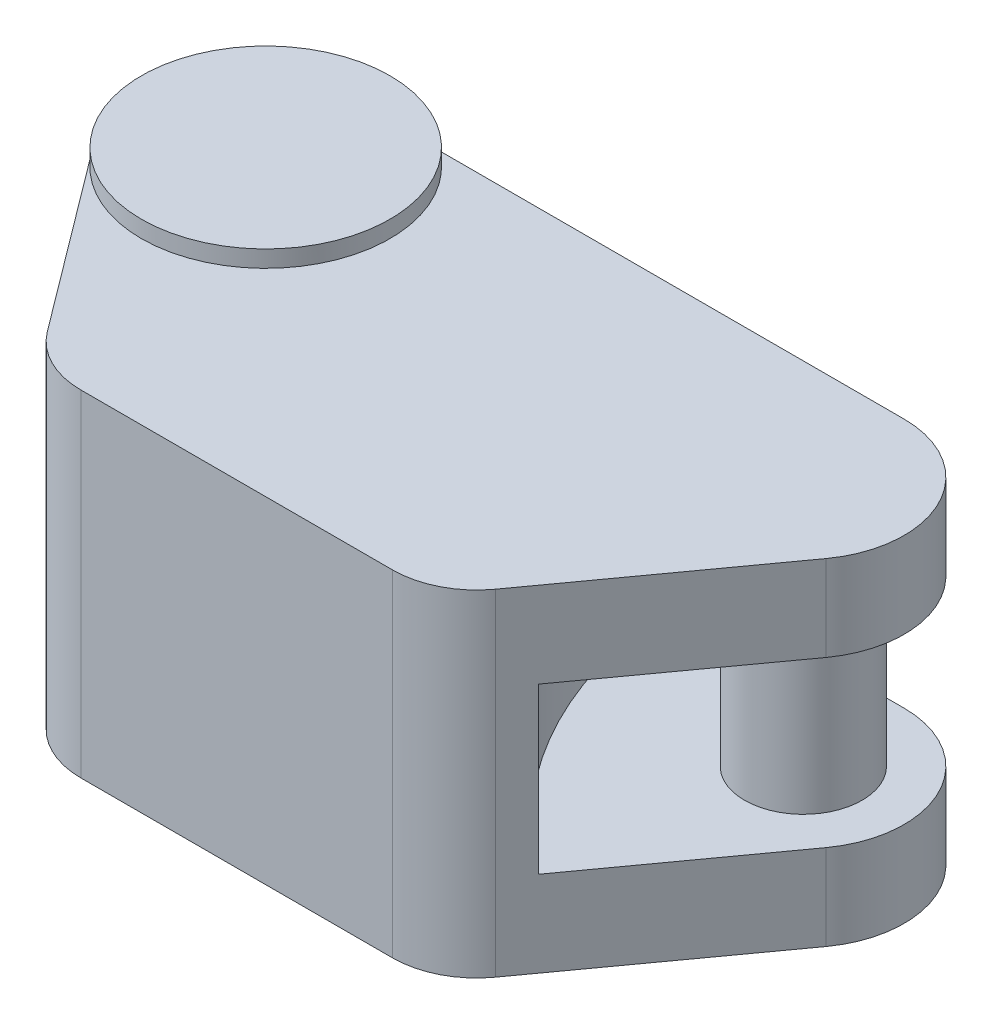
ISO-10303-21;
HEADER;
FILE_DESCRIPTION(('STEP AP214'),'2;1');
FILE_NAME('part.step','',(''),(''),'','','');
FILE_SCHEMA(('AUTOMOTIVE_DESIGN { 1 0 10303 214 1 1 1 1 }'));
ENDSEC;
DATA;
#1=APPLICATION_CONTEXT('core data for automotive mechanical design processes');
#2=APPLICATION_PROTOCOL_DEFINITION('international standard','automotive_design',2000,#1);
#3=PRODUCT_CONTEXT('',#1,'mechanical');
#4=PRODUCT('Part','Part','',(#3));
#5=PRODUCT_RELATED_PRODUCT_CATEGORY('part','',(#4));
#6=PRODUCT_DEFINITION_FORMATION('','',#4);
#7=PRODUCT_DEFINITION_CONTEXT('part definition',#1,'design');
#8=PRODUCT_DEFINITION('design','',#6,#7);
#9=PRODUCT_DEFINITION_SHAPE('','',#8);
#10=(LENGTH_UNIT() NAMED_UNIT(*) SI_UNIT(.MILLI.,.METRE.));
#11=(NAMED_UNIT(*) PLANE_ANGLE_UNIT() SI_UNIT($,.RADIAN.));
#12=(NAMED_UNIT(*) SI_UNIT($,.STERADIAN.) SOLID_ANGLE_UNIT());
#13=UNCERTAINTY_MEASURE_WITH_UNIT(LENGTH_MEASURE(1.E-05),#10,'distance_accuracy_value','');
#14=(GEOMETRIC_REPRESENTATION_CONTEXT(3) GLOBAL_UNCERTAINTY_ASSIGNED_CONTEXT((#13)) GLOBAL_UNIT_ASSIGNED_CONTEXT((#10,
#11,#12)) REPRESENTATION_CONTEXT('',''));
#15=CARTESIAN_POINT('',(0.,0.,0.));
#16=DIRECTION('',(0.,0.,1.));
#17=DIRECTION('',(1.,0.,0.));
#18=AXIS2_PLACEMENT_3D('',#15,#16,#17);
#19=CARTESIAN_POINT('',(203.2,-63.5,-38.1));
#20=DIRECTION('',(0.,0.,-1.));
#21=DIRECTION('',(-1.,0.,0.));
#22=AXIS2_PLACEMENT_3D('',#19,#20,#21);
#23=PLANE('',#22);
#24=DIRECTION('',(0.,1.,0.));
#25=VECTOR('',#24,1.);
#26=CARTESIAN_POINT('',(203.2,-63.5,-38.1));
#27=LINE('',#26,#25);
#28=CARTESIAN_POINT('',(203.2,31.115,-38.1));
#29=VERTEX_POINT('',#28);
#30=CARTESIAN_POINT('',(203.2,63.5,-38.1));
#31=VERTEX_POINT('',#30);
#32=EDGE_CURVE('E217',#29,#31,#27,.T.);
#33=ORIENTED_EDGE('',*,*,#32,.F.);
#34=DIRECTION('',(-1.,0.,0.));
#35=VECTOR('',#34,1.);
#36=CARTESIAN_POINT('',(125.379811820765,31.115,-38.1));
#37=LINE('',#36,#35);
#38=CARTESIAN_POINT('',(125.379811820765,31.115,-38.1));
#39=VERTEX_POINT('',#38);
#40=EDGE_CURVE('E148',#29,#39,#37,.T.);
#41=ORIENTED_EDGE('',*,*,#40,.T.);
#42=DIRECTION('',(0.,-1.,0.));
#43=VECTOR('',#42,1.);
#44=CARTESIAN_POINT('',(125.379811820765,31.115,-38.1));
#45=LINE('',#44,#43);
#46=CARTESIAN_POINT('',(125.379811820765,-31.115,-38.1));
#47=VERTEX_POINT('',#46);
#48=EDGE_CURVE('E139',#39,#47,#45,.T.);
#49=ORIENTED_EDGE('',*,*,#48,.T.);
#50=DIRECTION('',(-1.,0.,0.));
#51=VECTOR('',#50,1.);
#52=CARTESIAN_POINT('',(125.379811820765,-31.115,-38.1));
#53=LINE('',#52,#51);
#54=CARTESIAN_POINT('',(203.2,-31.115,-38.1));
#55=VERTEX_POINT('',#54);
#56=EDGE_CURVE('E126',#55,#47,#53,.T.);
#57=ORIENTED_EDGE('',*,*,#56,.F.);
#58=CARTESIAN_POINT('',(203.2,-63.5,-38.1));
#59=VERTEX_POINT('',#58);
#60=EDGE_CURVE('E215',#59,#55,#27,.T.);
#61=ORIENTED_EDGE('',*,*,#60,.F.);
#62=DIRECTION('',(-1.,0.,0.));
#63=VECTOR('',#62,1.);
#64=CARTESIAN_POINT('',(203.2,-63.5,-38.1));
#65=LINE('',#64,#63);
#66=CARTESIAN_POINT('',(27.5036379411888,-63.5,-38.1));
#67=VERTEX_POINT('',#66);
#68=EDGE_CURVE('E198',#59,#67,#65,.T.);
#69=ORIENTED_EDGE('',*,*,#68,.T.);
#70=DIRECTION('',(0.,1.,0.));
#71=VECTOR('',#70,1.);
#72=CARTESIAN_POINT('',(27.5036379411888,-63.5,-38.1));
#73=LINE('',#72,#71);
#74=CARTESIAN_POINT('',(27.5036379411888,63.5,-38.1));
#75=VERTEX_POINT('',#74);
#76=EDGE_CURVE('E212',#67,#75,#73,.T.);
#77=ORIENTED_EDGE('',*,*,#76,.T.);
#78=DIRECTION('',(-1.,0.,0.));
#79=VECTOR('',#78,1.);
#80=CARTESIAN_POINT('',(203.2,63.5,-38.1));
#81=LINE('',#80,#79);
#82=EDGE_CURVE('E179',#31,#75,#81,.T.);
#83=ORIENTED_EDGE('',*,*,#82,.F.);
#84=EDGE_LOOP('',(#33,#41,#49,#57,#61,#69,#77,#83));
#85=FACE_BOUND('',#84,.T.);
#86=ADVANCED_FACE('F38',(#85),#23,.T.);
#87=CARTESIAN_POINT('',(203.2,-63.5,0.));
#88=DIRECTION('',(0.,1.,0.));
#89=DIRECTION('',(0.,0.,1.));
#90=AXIS2_PLACEMENT_3D('',#87,#88,#89);
#91=CYLINDRICAL_SURFACE('',#90,38.1);
#92=DIRECTION('',(0.,1.,0.));
#93=VECTOR('',#92,1.);
#94=CARTESIAN_POINT('',(234.070981155776,-63.5,22.3291854414737));
#95=LINE('',#94,#93);
#96=CARTESIAN_POINT('',(234.070981155776,31.115,22.3291854414738));
#97=VERTEX_POINT('',#96);
#98=CARTESIAN_POINT('',(234.070981155776,63.5,22.3291854414737));
#99=VERTEX_POINT('',#98);
#100=EDGE_CURVE('E221',#97,#99,#95,.T.);
#101=ORIENTED_EDGE('',*,*,#100,.F.);
#102=CARTESIAN_POINT('',(203.2,31.115,0.));
#103=DIRECTION('',(0.,-1.,0.));
#104=DIRECTION('',(0.,0.,-1.));
#105=AXIS2_PLACEMENT_3D('',#102,#103,#104);
#106=CIRCLE('',#105,38.1);
#107=EDGE_CURVE('E156',#97,#29,#106,.F.);
#108=ORIENTED_EDGE('',*,*,#107,.T.);
#109=ORIENTED_EDGE('',*,*,#32,.T.);
#110=CARTESIAN_POINT('',(203.2,63.5,0.));
#111=DIRECTION('',(0.,1.,0.));
#112=DIRECTION('',(0.,0.,1.));
#113=AXIS2_PLACEMENT_3D('',#110,#111,#112);
#114=CIRCLE('',#113,38.1);
#115=EDGE_CURVE('E176',#99,#31,#114,.T.);
#116=ORIENTED_EDGE('',*,*,#115,.F.);
#117=EDGE_LOOP('',(#101,#108,#109,#116));
#118=FACE_BOUND('',#117,.T.);
#119=ADVANCED_FACE('F252',(#118),#91,.T.);
#120=CARTESIAN_POINT('',(181.646823701004,-63.5,94.8076545345614));
#121=DIRECTION('',(0.810261972592545,0.,0.586067859356268));
#122=DIRECTION('',(0.586067859356268,0.,-0.810261972592545));
#123=AXIS2_PLACEMENT_3D('',#120,#121,#122);
#124=PLANE('',#123);
#125=DIRECTION('',(0.,-1.,0.));
#126=VECTOR('',#125,1.);
#127=CARTESIAN_POINT('',(188.46307005487,31.115,85.3839246231039));
#128=LINE('',#127,#126);
#129=CARTESIAN_POINT('',(188.46307005487,31.115,85.3839246231039));
#130=VERTEX_POINT('',#129);
#131=CARTESIAN_POINT('',(188.46307005487,-31.115,85.3839246231039));
#132=VERTEX_POINT('',#131);
#133=EDGE_CURVE('E142',#130,#132,#128,.T.);
#134=ORIENTED_EDGE('',*,*,#133,.F.);
#135=DIRECTION('',(0.586067859356267,0.,-0.810261972592545));
#136=VECTOR('',#135,1.);
#137=CARTESIAN_POINT('',(277.779811820765,31.115,-38.1));
#138=LINE('',#137,#136);
#139=EDGE_CURVE('E151',#130,#97,#138,.T.);
#140=ORIENTED_EDGE('',*,*,#139,.T.);
#141=ORIENTED_EDGE('',*,*,#100,.T.);
#142=DIRECTION('',(0.586067859356268,0.,-0.810261972592545));
#143=VECTOR('',#142,1.);
#144=CARTESIAN_POINT('',(181.646823701004,63.5,94.8076545345614));
#145=LINE('',#144,#143);
#146=CARTESIAN_POINT('',(181.646823701004,63.5,94.8076545345615));
#147=VERTEX_POINT('',#146);
#148=EDGE_CURVE('E173',#147,#99,#145,.T.);
#149=ORIENTED_EDGE('',*,*,#148,.F.);
#150=DIRECTION('',(0.,1.,0.));
#151=VECTOR('',#150,1.);
#152=CARTESIAN_POINT('',(181.646823701004,-63.5,94.8076545345615));
#153=LINE('',#152,#151);
#154=CARTESIAN_POINT('',(181.646823701004,-63.5,94.8076545345615));
#155=VERTEX_POINT('',#154);
#156=EDGE_CURVE('E222',#155,#147,#153,.T.);
#157=ORIENTED_EDGE('',*,*,#156,.F.);
#158=DIRECTION('',(0.586067859356268,0.,-0.810261972592545));
#159=VECTOR('',#158,1.);
#160=CARTESIAN_POINT('',(181.646823701004,-63.5,94.8076545345614));
#161=LINE('',#160,#159);
#162=CARTESIAN_POINT('',(234.070981155776,-63.5,22.3291854414737));
#163=VERTEX_POINT('',#162);
#164=EDGE_CURVE('E192',#155,#163,#161,.T.);
#165=ORIENTED_EDGE('',*,*,#164,.T.);
#166=CARTESIAN_POINT('',(234.070981155776,-31.115,22.3291854414738));
#167=VERTEX_POINT('',#166);
#168=EDGE_CURVE('E218',#163,#167,#95,.T.);
#169=ORIENTED_EDGE('',*,*,#168,.T.);
#170=DIRECTION('',(0.586067859356267,0.,-0.810261972592545));
#171=VECTOR('',#170,1.);
#172=CARTESIAN_POINT('',(277.779811820765,-31.115,-38.1));
#173=LINE('',#172,#171);
#174=EDGE_CURVE('E134',#132,#167,#173,.T.);
#175=ORIENTED_EDGE('',*,*,#174,.F.);
#176=EDGE_LOOP('',(#134,#140,#141,#149,#157,#165,#169,#175));
#177=FACE_BOUND('',#176,.T.);
#178=ADVANCED_FACE('F248',(#177),#124,.T.);
#179=CARTESIAN_POINT('',(38.1,-63.5,76.2));
#180=DIRECTION('',(0.,1.,0.));
#181=DIRECTION('',(0.,0.,1.));
#182=AXIS2_PLACEMENT_3D('',#179,#180,#181);
#183=CYLINDRICAL_SURFACE('',#182,31.75);
#184=DIRECTION('',(0.,1.,0.));
#185=VECTOR('',#184,1.);
#186=CARTESIAN_POINT('',(38.1,-63.5,107.95));
#187=LINE('',#186,#185);
#188=CARTESIAN_POINT('',(38.1,-63.5,107.95));
#189=VERTEX_POINT('',#188);
#190=CARTESIAN_POINT('',(38.1,63.5,107.95));
#191=VERTEX_POINT('',#190);
#192=EDGE_CURVE('E207',#189,#191,#187,.T.);
#193=ORIENTED_EDGE('',*,*,#192,.T.);
#194=CARTESIAN_POINT('',(38.1,63.5,76.2));
#195=DIRECTION('',(0.,1.,0.));
#196=DIRECTION('',(0.,0.,1.));
#197=AXIS2_PLACEMENT_3D('',#194,#195,#196);
#198=CIRCLE('',#197,31.75);
#199=CARTESIAN_POINT('',(12.7,63.5,95.25));
#200=VERTEX_POINT('',#199);
#201=EDGE_CURVE('E162',#200,#191,#198,.T.);
#202=ORIENTED_EDGE('',*,*,#201,.F.);
#203=DIRECTION('',(0.,1.,0.));
#204=VECTOR('',#203,1.);
#205=CARTESIAN_POINT('',(12.7,-63.5,95.25));
#206=LINE('',#205,#204);
#207=CARTESIAN_POINT('',(12.7,-63.5,95.25));
#208=VERTEX_POINT('',#207);
#209=EDGE_CURVE('E61',#208,#200,#206,.T.);
#210=ORIENTED_EDGE('',*,*,#209,.F.);
#211=CARTESIAN_POINT('',(38.1,-63.5,76.2));
#212=DIRECTION('',(0.,1.,0.));
#213=DIRECTION('',(0.,0.,1.));
#214=AXIS2_PLACEMENT_3D('',#211,#212,#213);
#215=CIRCLE('',#214,31.75);
#216=EDGE_CURVE('E184',#208,#189,#215,.T.);
#217=ORIENTED_EDGE('',*,*,#216,.T.);
#218=EDGE_LOOP('',(#193,#202,#210,#217));
#219=FACE_BOUND('',#218,.T.);
#220=ADVANCED_FACE('F40',(#219),#183,.T.);
#221=CARTESIAN_POINT('',(12.7,-63.5,95.25));
#222=DIRECTION('',(-0.8,0.,0.6));
#223=DIRECTION('',(0.6,0.,0.8));
#224=AXIS2_PLACEMENT_3D('',#221,#222,#223);
#225=PLANE('',#224);
#226=ORIENTED_EDGE('',*,*,#209,.T.);
#227=DIRECTION('',(0.6,0.,0.8));
#228=VECTOR('',#227,1.);
#229=CARTESIAN_POINT('',(12.7,63.5,95.25));
#230=LINE('',#229,#228);
#231=CARTESIAN_POINT('',(-37.592,63.5,28.194));
#232=VERTEX_POINT('',#231);
#233=EDGE_CURVE('E181',#232,#200,#230,.T.);
#234=ORIENTED_EDGE('',*,*,#233,.F.);
#235=DIRECTION('',(0.,1.,0.));
#236=VECTOR('',#235,1.);
#237=CARTESIAN_POINT('',(-37.592,-63.5,28.194));
#238=LINE('',#237,#236);
#239=CARTESIAN_POINT('',(-37.592,-63.5,28.194));
#240=VERTEX_POINT('',#239);
#241=EDGE_CURVE('E209',#240,#232,#238,.T.);
#242=ORIENTED_EDGE('',*,*,#241,.F.);
#243=DIRECTION('',(0.6,0.,0.8));
#244=VECTOR('',#243,1.);
#245=CARTESIAN_POINT('',(12.7,-63.5,95.25));
#246=LINE('',#245,#244);
#247=EDGE_CURVE('E204',#240,#208,#246,.T.);
#248=ORIENTED_EDGE('',*,*,#247,.T.);
#249=EDGE_LOOP('',(#226,#234,#242,#248));
#250=FACE_BOUND('',#249,.T.);
#251=ADVANCED_FACE('F234',(#250),#225,.T.);
#252=CARTESIAN_POINT('',(0.,-63.5,0.));
#253=DIRECTION('',(0.,1.,0.));
#254=DIRECTION('',(0.,0.,1.));
#255=AXIS2_PLACEMENT_3D('',#252,#253,#254);
#256=CYLINDRICAL_SURFACE('',#255,46.99);
#257=ORIENTED_EDGE('',*,*,#241,.T.);
#258=CARTESIAN_POINT('',(0.,63.5,0.));
#259=DIRECTION('',(0.,1.,0.));
#260=DIRECTION('',(0.,0.,1.));
#261=AXIS2_PLACEMENT_3D('',#258,#259,#260);
#262=CIRCLE('',#261,46.99);
#263=EDGE_CURVE('E46',#232,#75,#262,.T.);
#264=ORIENTED_EDGE('',*,*,#263,.T.);
#265=ORIENTED_EDGE('',*,*,#76,.F.);
#266=CARTESIAN_POINT('',(0.,-63.5,0.));
#267=DIRECTION('',(0.,1.,0.));
#268=DIRECTION('',(0.,0.,1.));
#269=AXIS2_PLACEMENT_3D('',#266,#267,#268);
#270=CIRCLE('',#269,46.99);
#271=EDGE_CURVE('E201',#67,#240,#270,.T.);
#272=ORIENTED_EDGE('',*,*,#271,.T.);
#273=EDGE_LOOP('',(#257,#264,#265,#272));
#274=FACE_BOUND('',#273,.T.);
#275=CARTESIAN_POINT('',(0.,69.85,0.));
#276=DIRECTION('',(0.,1.,0.));
#277=DIRECTION('',(0.,0.,1.));
#278=AXIS2_PLACEMENT_3D('',#275,#276,#277);
#279=CIRCLE('',#278,46.99);
#280=CARTESIAN_POINT('',(0.,69.85,46.99));
#281=VERTEX_POINT('',#280);
#282=EDGE_CURVE('E159',#281,#281,#279,.T.);
#283=ORIENTED_EDGE('',*,*,#282,.F.);
#284=EDGE_LOOP('',(#283));
#285=FACE_BOUND('',#284,.T.);
#286=ADVANCED_FACE('F255',(#274,#285),#256,.T.);
#287=CARTESIAN_POINT('',(203.2,-31.115,0.));
#288=DIRECTION('',(0.,-1.,0.));
#289=DIRECTION('',(0.,0.,-1.));
#290=AXIS2_PLACEMENT_3D('',#287,#288,#289);
#291=CIRCLE('',#290,38.1);
#292=EDGE_CURVE('E129',#167,#55,#291,.F.);
#293=ORIENTED_EDGE('',*,*,#292,.F.);
#294=ORIENTED_EDGE('',*,*,#168,.F.);
#295=CARTESIAN_POINT('',(203.2,-63.5,0.));
#296=DIRECTION('',(0.,1.,0.));
#297=DIRECTION('',(0.,0.,1.));
#298=AXIS2_PLACEMENT_3D('',#295,#296,#297);
#299=CIRCLE('',#298,38.1);
#300=EDGE_CURVE('E195',#163,#59,#299,.T.);
#301=ORIENTED_EDGE('',*,*,#300,.T.);
#302=ORIENTED_EDGE('',*,*,#60,.T.);
#303=EDGE_LOOP('',(#293,#294,#301,#302));
#304=FACE_BOUND('',#303,.T.);
#305=ADVANCED_FACE('F258',(#304),#91,.T.);
#306=CARTESIAN_POINT('',(155.921006071191,-63.5,76.2));
#307=DIRECTION('',(0.,1.,0.));
#308=DIRECTION('',(0.,0.,1.));
#309=AXIS2_PLACEMENT_3D('',#306,#307,#308);
#310=CYLINDRICAL_SURFACE('',#309,31.75);
#311=ORIENTED_EDGE('',*,*,#156,.T.);
#312=CARTESIAN_POINT('',(155.921006071191,63.5,76.2));
#313=DIRECTION('',(0.,1.,0.));
#314=DIRECTION('',(0.,0.,1.));
#315=AXIS2_PLACEMENT_3D('',#312,#313,#314);
#316=CIRCLE('',#315,31.75);
#317=CARTESIAN_POINT('',(155.921006071191,63.5,107.95));
#318=VERTEX_POINT('',#317);
#319=EDGE_CURVE('E170',#318,#147,#316,.T.);
#320=ORIENTED_EDGE('',*,*,#319,.F.);
#321=DIRECTION('',(0.,1.,0.));
#322=VECTOR('',#321,1.);
#323=CARTESIAN_POINT('',(155.921006071191,-63.5,107.95));
#324=LINE('',#323,#322);
#325=CARTESIAN_POINT('',(155.921006071191,-63.5,107.95));
#326=VERTEX_POINT('',#325);
#327=EDGE_CURVE('E224',#326,#318,#324,.T.);
#328=ORIENTED_EDGE('',*,*,#327,.F.);
#329=CARTESIAN_POINT('',(155.921006071191,-63.5,76.2));
#330=DIRECTION('',(0.,1.,0.));
#331=DIRECTION('',(0.,0.,1.));
#332=AXIS2_PLACEMENT_3D('',#329,#330,#331);
#333=CIRCLE('',#332,31.75);
#334=EDGE_CURVE('E189',#326,#155,#333,.T.);
#335=ORIENTED_EDGE('',*,*,#334,.T.);
#336=EDGE_LOOP('',(#311,#320,#328,#335));
#337=FACE_BOUND('',#336,.T.);
#338=ADVANCED_FACE('F244',(#337),#310,.T.);
#339=CARTESIAN_POINT('',(38.1,-63.5,107.95));
#340=DIRECTION('',(0.,0.,1.));
#341=DIRECTION('',(1.,0.,0.));
#342=AXIS2_PLACEMENT_3D('',#339,#340,#341);
#343=PLANE('',#342);
#344=ORIENTED_EDGE('',*,*,#327,.T.);
#345=DIRECTION('',(1.,0.,0.));
#346=VECTOR('',#345,1.);
#347=CARTESIAN_POINT('',(38.1,63.5,107.95));
#348=LINE('',#347,#346);
#349=EDGE_CURVE('E167',#191,#318,#348,.T.);
#350=ORIENTED_EDGE('',*,*,#349,.F.);
#351=ORIENTED_EDGE('',*,*,#192,.F.);
#352=DIRECTION('',(1.,0.,0.));
#353=VECTOR('',#352,1.);
#354=CARTESIAN_POINT('',(38.1,-63.5,107.95));
#355=LINE('',#354,#353);
#356=EDGE_CURVE('E186',#189,#326,#355,.T.);
#357=ORIENTED_EDGE('',*,*,#356,.T.);
#358=EDGE_LOOP('',(#344,#350,#351,#357));
#359=FACE_BOUND('',#358,.T.);
#360=ADVANCED_FACE('F228',(#359),#343,.T.);
#361=CARTESIAN_POINT('',(38.1,-63.5,76.2));
#362=DIRECTION('',(0.,1.,0.));
#363=DIRECTION('',(0.,0.,1.));
#364=AXIS2_PLACEMENT_3D('',#361,#362,#363);
#365=PLANE('',#364);
#366=ORIENTED_EDGE('',*,*,#216,.F.);
#367=ORIENTED_EDGE('',*,*,#247,.F.);
#368=ORIENTED_EDGE('',*,*,#271,.F.);
#369=ORIENTED_EDGE('',*,*,#68,.F.);
#370=ORIENTED_EDGE('',*,*,#300,.F.);
#371=ORIENTED_EDGE('',*,*,#164,.F.);
#372=ORIENTED_EDGE('',*,*,#334,.F.);
#373=ORIENTED_EDGE('',*,*,#356,.F.);
#374=EDGE_LOOP('',(#366,#367,#368,#369,#370,#371,#372,#373));
#375=FACE_BOUND('',#374,.T.);
#376=ADVANCED_FACE('F238',(#375),#365,.F.);
#377=CARTESIAN_POINT('',(38.1,63.5,76.2));
#378=DIRECTION('',(0.,1.,0.));
#379=DIRECTION('',(0.,0.,1.));
#380=AXIS2_PLACEMENT_3D('',#377,#378,#379);
#381=PLANE('',#380);
#382=ORIENTED_EDGE('',*,*,#263,.F.);
#383=ORIENTED_EDGE('',*,*,#233,.T.);
#384=ORIENTED_EDGE('',*,*,#201,.T.);
#385=ORIENTED_EDGE('',*,*,#349,.T.);
#386=ORIENTED_EDGE('',*,*,#319,.T.);
#387=ORIENTED_EDGE('',*,*,#148,.T.);
#388=ORIENTED_EDGE('',*,*,#115,.T.);
#389=ORIENTED_EDGE('',*,*,#82,.T.);
#390=EDGE_LOOP('',(#382,#383,#384,#385,#386,#387,#388,#389));
#391=FACE_BOUND('',#390,.T.);
#392=ADVANCED_FACE('F231',(#391),#381,.T.);
#393=CARTESIAN_POINT('',(0.,69.85,0.));
#394=DIRECTION('',(0.,1.,0.));
#395=DIRECTION('',(0.,0.,1.));
#396=AXIS2_PLACEMENT_3D('',#393,#394,#395);
#397=PLANE('',#396);
#398=ORIENTED_EDGE('',*,*,#282,.T.);
#399=EDGE_LOOP('',(#398));
#400=FACE_BOUND('',#399,.T.);
#401=ADVANCED_FACE('F262',(#400),#397,.T.);
#402=CARTESIAN_POINT('',(277.779811820765,31.115,-38.1));
#403=DIRECTION('',(0.,-1.,0.));
#404=DIRECTION('',(0.,0.,-1.));
#405=AXIS2_PLACEMENT_3D('',#402,#403,#404);
#406=CYLINDRICAL_SURFACE('',#405,152.4);
#407=ORIENTED_EDGE('',*,*,#48,.F.);
#408=CARTESIAN_POINT('',(277.779811820765,31.115,-38.1));
#409=DIRECTION('',(0.,1.,0.));
#410=DIRECTION('',(0.,0.,-1.));
#411=AXIS2_PLACEMENT_3D('',#408,#409,#410);
#412=CIRCLE('',#411,152.4);
#413=EDGE_CURVE('E133',#39,#130,#412,.T.);
#414=ORIENTED_EDGE('',*,*,#413,.T.);
#415=ORIENTED_EDGE('',*,*,#133,.T.);
#416=CARTESIAN_POINT('',(277.779811820765,-31.115,-38.1));
#417=DIRECTION('',(0.,1.,0.));
#418=DIRECTION('',(0.,0.,-1.));
#419=AXIS2_PLACEMENT_3D('',#416,#417,#418);
#420=CIRCLE('',#419,152.4);
#421=EDGE_CURVE('E53',#47,#132,#420,.T.);
#422=ORIENTED_EDGE('',*,*,#421,.F.);
#423=EDGE_LOOP('',(#407,#414,#415,#422));
#424=FACE_BOUND('',#423,.T.);
#425=ADVANCED_FACE('F137',(#424),#406,.F.);
#426=CARTESIAN_POINT('',(277.779811820765,31.115,-38.1));
#427=DIRECTION('',(0.,-1.,0.));
#428=DIRECTION('',(0.,0.,-1.));
#429=AXIS2_PLACEMENT_3D('',#426,#427,#428);
#430=PLANE('',#429);
#431=CARTESIAN_POINT('',(203.2,31.115,0.));
#432=DIRECTION('',(0.,-1.,0.));
#433=DIRECTION('',(0.,0.,-1.));
#434=AXIS2_PLACEMENT_3D('',#431,#432,#433);
#435=CIRCLE('',#434,22.225);
#436=CARTESIAN_POINT('',(203.2,31.115,22.225));
#437=VERTEX_POINT('',#436);
#438=EDGE_CURVE('E11',#437,#437,#435,.T.);
#439=ORIENTED_EDGE('',*,*,#438,.F.);
#440=EDGE_LOOP('',(#439));
#441=FACE_BOUND('',#440,.T.);
#442=ORIENTED_EDGE('',*,*,#139,.F.);
#443=ORIENTED_EDGE('',*,*,#413,.F.);
#444=ORIENTED_EDGE('',*,*,#40,.F.);
#445=ORIENTED_EDGE('',*,*,#107,.F.);
#446=EDGE_LOOP('',(#442,#443,#444,#445));
#447=FACE_BOUND('',#446,.T.);
#448=ADVANCED_FACE('F270',(#441,#447),#430,.T.);
#449=CARTESIAN_POINT('',(277.779811820765,-31.115,-38.1));
#450=DIRECTION('',(0.,-1.,0.));
#451=DIRECTION('',(0.,0.,-1.));
#452=AXIS2_PLACEMENT_3D('',#449,#450,#451);
#453=PLANE('',#452);
#454=CARTESIAN_POINT('',(203.2,-31.115,0.));
#455=DIRECTION('',(0.,1.,0.));
#456=DIRECTION('',(0.,0.,1.));
#457=AXIS2_PLACEMENT_3D('',#454,#455,#456);
#458=CIRCLE('',#457,22.225);
#459=CARTESIAN_POINT('',(203.2,-31.115,22.225));
#460=VERTEX_POINT('',#459);
#461=EDGE_CURVE('E144',#460,#460,#458,.T.);
#462=ORIENTED_EDGE('',*,*,#461,.F.);
#463=EDGE_LOOP('',(#462));
#464=FACE_BOUND('',#463,.T.);
#465=ORIENTED_EDGE('',*,*,#292,.T.);
#466=ORIENTED_EDGE('',*,*,#56,.T.);
#467=ORIENTED_EDGE('',*,*,#421,.T.);
#468=ORIENTED_EDGE('',*,*,#174,.T.);
#469=EDGE_LOOP('',(#465,#466,#467,#468));
#470=FACE_BOUND('',#469,.T.);
#471=ADVANCED_FACE('F127',(#464,#470),#453,.F.);
#472=CARTESIAN_POINT('',(203.2,-31.115,0.));
#473=DIRECTION('',(0.,1.,0.));
#474=DIRECTION('',(0.,0.,1.));
#475=AXIS2_PLACEMENT_3D('',#472,#473,#474);
#476=CYLINDRICAL_SURFACE('',#475,22.225);
#477=CARTESIAN_POINT('',(203.2,-31.115,22.225));
#478=CARTESIAN_POINT('',(203.2,-30.4667708333333,22.225));
#479=CARTESIAN_POINT('',(203.2,-29.8185416666667,22.225));
#480=CARTESIAN_POINT('',(203.2,-28.5220833333333,22.225));
#481=CARTESIAN_POINT('',(203.2,-27.8738541666667,22.225));
#482=CARTESIAN_POINT('',(203.2,-26.5773958333333,22.225));
#483=CARTESIAN_POINT('',(203.2,-25.9291666666667,22.225));
#484=CARTESIAN_POINT('',(203.2,-24.6327083333333,22.225));
#485=CARTESIAN_POINT('',(203.2,-23.9844791666667,22.225));
#486=CARTESIAN_POINT('',(203.2,-22.6880208333333,22.225));
#487=CARTESIAN_POINT('',(203.2,-22.0397916666667,22.225));
#488=CARTESIAN_POINT('',(203.2,-20.7433333333333,22.225));
#489=CARTESIAN_POINT('',(203.2,-20.0951041666667,22.225));
#490=CARTESIAN_POINT('',(203.2,-18.7986458333333,22.225));
#491=CARTESIAN_POINT('',(203.2,-18.1504166666667,22.225));
#492=CARTESIAN_POINT('',(203.2,-16.8539583333333,22.225));
#493=CARTESIAN_POINT('',(203.2,-16.2057291666667,22.225));
#494=CARTESIAN_POINT('',(203.2,-14.9092708333333,22.225));
#495=CARTESIAN_POINT('',(203.2,-14.2610416666667,22.225));
#496=CARTESIAN_POINT('',(203.2,-12.9645833333333,22.225));
#497=CARTESIAN_POINT('',(203.2,-12.3163541666667,22.225));
#498=CARTESIAN_POINT('',(203.2,-11.0198958333333,22.225));
#499=CARTESIAN_POINT('',(203.2,-10.3716666666667,22.225));
#500=CARTESIAN_POINT('',(203.2,-9.07520833333333,22.225));
#501=CARTESIAN_POINT('',(203.2,-8.42697916666667,22.225));
#502=CARTESIAN_POINT('',(203.2,-7.13052083333333,22.225));
#503=CARTESIAN_POINT('',(203.2,-6.48229166666667,22.225));
#504=CARTESIAN_POINT('',(203.2,-5.18583333333333,22.225));
#505=CARTESIAN_POINT('',(203.2,-4.53760416666667,22.225));
#506=CARTESIAN_POINT('',(203.2,-3.24114583333333,22.225));
#507=CARTESIAN_POINT('',(203.2,-2.59291666666667,22.225));
#508=CARTESIAN_POINT('',(203.2,-1.29645833333333,22.225));
#509=CARTESIAN_POINT('',(203.2,-0.648229166666667,22.225));
#510=CARTESIAN_POINT('',(203.2,0.648229166666666,22.225));
#511=CARTESIAN_POINT('',(203.2,1.29645833333333,22.225));
#512=CARTESIAN_POINT('',(203.2,2.59291666666666,22.225));
#513=CARTESIAN_POINT('',(203.2,3.24114583333333,22.225));
#514=CARTESIAN_POINT('',(203.2,4.53760416666666,22.225));
#515=CARTESIAN_POINT('',(203.2,5.18583333333333,22.225));
#516=CARTESIAN_POINT('',(203.2,6.48229166666666,22.225));
#517=CARTESIAN_POINT('',(203.2,7.13052083333333,22.225));
#518=CARTESIAN_POINT('',(203.2,8.42697916666666,22.225));
#519=CARTESIAN_POINT('',(203.2,9.07520833333333,22.225));
#520=CARTESIAN_POINT('',(203.2,10.3716666666667,22.225));
#521=CARTESIAN_POINT('',(203.2,11.0198958333333,22.225));
#522=CARTESIAN_POINT('',(203.2,12.3163541666667,22.225));
#523=CARTESIAN_POINT('',(203.2,12.9645833333333,22.225));
#524=CARTESIAN_POINT('',(203.2,14.2610416666667,22.225));
#525=CARTESIAN_POINT('',(203.2,14.9092708333333,22.225));
#526=CARTESIAN_POINT('',(203.2,16.2057291666667,22.225));
#527=CARTESIAN_POINT('',(203.2,16.8539583333333,22.225));
#528=CARTESIAN_POINT('',(203.2,18.1504166666667,22.225));
#529=CARTESIAN_POINT('',(203.2,18.7986458333333,22.225));
#530=CARTESIAN_POINT('',(203.2,20.0951041666667,22.225));
#531=CARTESIAN_POINT('',(203.2,20.7433333333333,22.225));
#532=CARTESIAN_POINT('',(203.2,22.0397916666667,22.225));
#533=CARTESIAN_POINT('',(203.2,22.6880208333333,22.225));
#534=CARTESIAN_POINT('',(203.2,23.9844791666667,22.225));
#535=CARTESIAN_POINT('',(203.2,24.6327083333333,22.225));
#536=CARTESIAN_POINT('',(203.2,25.9291666666667,22.225));
#537=CARTESIAN_POINT('',(203.2,26.5773958333333,22.225));
#538=CARTESIAN_POINT('',(203.2,27.8738541666667,22.225));
#539=CARTESIAN_POINT('',(203.2,28.5220833333333,22.225));
#540=CARTESIAN_POINT('',(203.2,29.8185416666667,22.225));
#541=CARTESIAN_POINT('',(203.2,30.4667708333333,22.225));
#542=CARTESIAN_POINT('',(203.2,31.115,22.225));
#543=B_SPLINE_CURVE_WITH_KNOTS('',3,(#477,#478,#479,#480,#481,#482,#483,#484,#485,#486,#487,
#488,#489,#490,#491,#492,#493,#494,#495,#496,#497,#498,#499,#500,#501,#502,#503,#504,#505,#506,
#507,#508,#509,#510,#511,#512,#513,#514,#515,#516,#517,#518,#519,#520,#521,#522,#523,#524,#525,
#526,#527,#528,#529,#530,#531,#532,#533,#534,#535,#536,#537,#538,#539,#540,#541,#542),
.UNSPECIFIED.,.F.,.F.,(4,2,2,2,2,2,2,2,2,2,2,2,2,2,2,2,2,2,2,2,2,2,2,2,2,2,2,2,2,2,2,2,4),(0.,
1.9446875,3.889375,5.8340625,7.77875,9.7234375,11.668125,13.6128125,15.5575,17.5021875,
19.446875,21.3915625,23.33625,25.2809375,27.225625,29.1703125,31.115,33.0596875,35.004375,
36.9490625,38.89375,40.8384375,42.783125,44.7278125,46.6725,48.6171875,50.561875,52.5065625,
54.45125,56.3959375,58.340625,60.2853125,62.23),.UNSPECIFIED.);
#544=EDGE_CURVE('BSEAM375',#460,#437,#543,.T.);
#545=ORIENTED_EDGE('',*,*,#461,.T.);
#546=ORIENTED_EDGE('',*,*,#438,.T.);
#547=ORIENTED_EDGE('',*,*,#544,.T.);
#548=ORIENTED_EDGE('',*,*,#544,.F.);
#549=EDGE_LOOP('',(#545,#547,#546,#548));
#550=FACE_BOUND('',#549,.T.);
#551=ADVANCED_FACE('F375',(#550),#476,.T.);
#552=CLOSED_SHELL('',(#86,#119,#178,#220,#251,#286,#305,#338,#360,#376,#392,#401,#425,#448,#471,#551));
#553=MANIFOLD_SOLID_BREP('B2',#552);
#554=ADVANCED_BREP_SHAPE_REPRESENTATION('',(#18,#553),#14);
#555=SHAPE_DEFINITION_REPRESENTATION(#9,#554);
ENDSEC;
END-ISO-10303-21;
